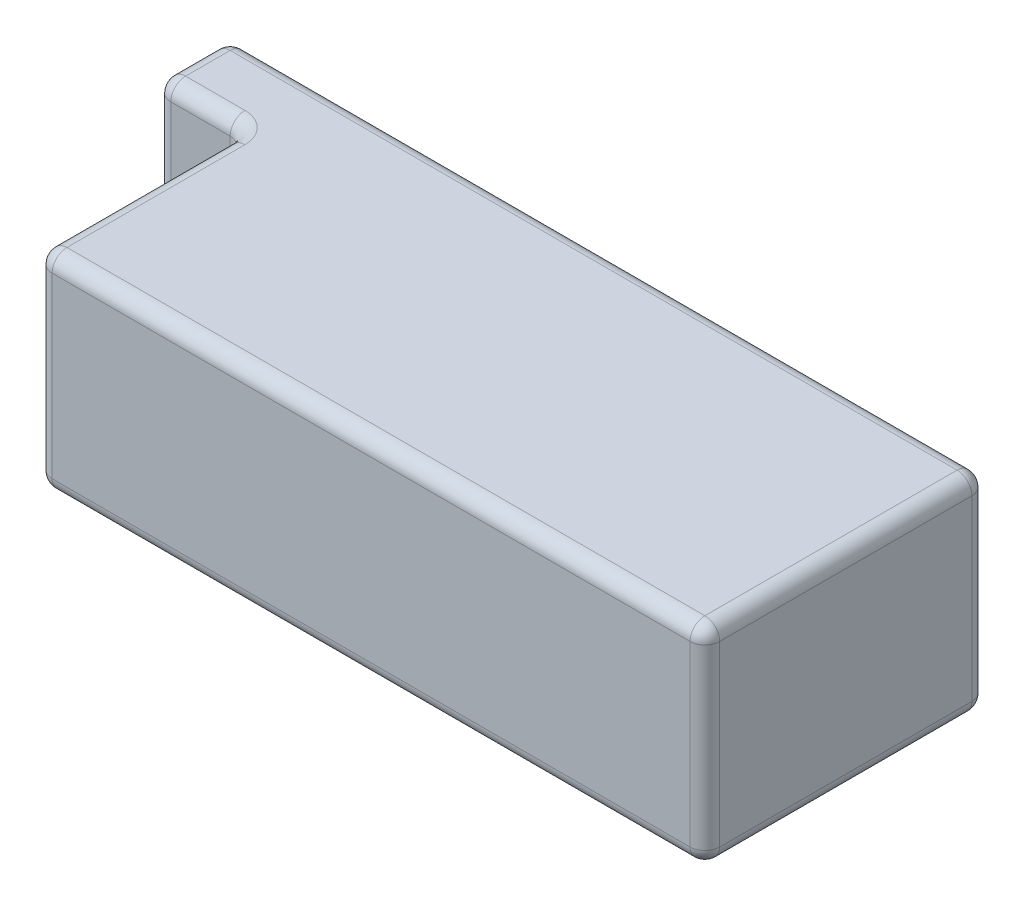
ISO-10303-21;
HEADER;
FILE_DESCRIPTION(('STEP AP214'),'2;1');
FILE_NAME('part.step','',(''),(''),'','','');
FILE_SCHEMA(('AUTOMOTIVE_DESIGN { 1 0 10303 214 1 1 1 1 }'));
ENDSEC;
DATA;
#1=APPLICATION_CONTEXT('core data for automotive mechanical design processes');
#2=APPLICATION_PROTOCOL_DEFINITION('international standard','automotive_design',2000,#1);
#3=PRODUCT_CONTEXT('',#1,'mechanical');
#4=PRODUCT('Part','Part','',(#3));
#5=PRODUCT_RELATED_PRODUCT_CATEGORY('part','',(#4));
#6=PRODUCT_DEFINITION_FORMATION('','',#4);
#7=PRODUCT_DEFINITION_CONTEXT('part definition',#1,'design');
#8=PRODUCT_DEFINITION('design','',#6,#7);
#9=PRODUCT_DEFINITION_SHAPE('','',#8);
#10=(LENGTH_UNIT() NAMED_UNIT(*) SI_UNIT(.MILLI.,.METRE.));
#11=(NAMED_UNIT(*) PLANE_ANGLE_UNIT() SI_UNIT($,.RADIAN.));
#12=(NAMED_UNIT(*) SI_UNIT($,.STERADIAN.) SOLID_ANGLE_UNIT());
#13=UNCERTAINTY_MEASURE_WITH_UNIT(LENGTH_MEASURE(1.E-05),#10,'distance_accuracy_value','');
#14=(GEOMETRIC_REPRESENTATION_CONTEXT(3) GLOBAL_UNCERTAINTY_ASSIGNED_CONTEXT((#13)) GLOBAL_UNIT_ASSIGNED_CONTEXT((#10,
#11,#12)) REPRESENTATION_CONTEXT('',''));
#15=CARTESIAN_POINT('',(0.,0.,0.));
#16=DIRECTION('',(0.,0.,1.));
#17=DIRECTION('',(1.,0.,0.));
#18=AXIS2_PLACEMENT_3D('',#15,#16,#17);
#19=CARTESIAN_POINT('',(22.5,14.,9.5));
#20=DIRECTION('',(-1.,0.,0.));
#21=DIRECTION('',(0.,0.,1.));
#22=AXIS2_PLACEMENT_3D('',#19,#20,#21);
#23=PLANE('',#22);
#24=DIRECTION('',(0.,-1.,0.));
#25=VECTOR('',#24,1.);
#26=CARTESIAN_POINT('',(22.5,14.,8.5));
#27=LINE('',#26,#25);
#28=CARTESIAN_POINT('',(22.5,13.,8.5));
#29=VERTEX_POINT('',#28);
#30=CARTESIAN_POINT('',(22.5,1.,8.5));
#31=VERTEX_POINT('',#30);
#32=EDGE_CURVE('E10',#29,#31,#27,.T.);
#33=ORIENTED_EDGE('',*,*,#32,.T.);
#34=DIRECTION('',(0.,0.,-1.));
#35=VECTOR('',#34,1.);
#36=CARTESIAN_POINT('',(22.5,1.,-9.5));
#37=LINE('',#36,#35);
#38=CARTESIAN_POINT('',(22.5,1.,-8.5));
#39=VERTEX_POINT('',#38);
#40=EDGE_CURVE('E146',#31,#39,#37,.T.);
#41=ORIENTED_EDGE('',*,*,#40,.T.);
#42=DIRECTION('',(0.,1.,0.));
#43=VECTOR('',#42,1.);
#44=CARTESIAN_POINT('',(22.5,14.,-8.5));
#45=LINE('',#44,#43);
#46=CARTESIAN_POINT('',(22.5,13.,-8.5));
#47=VERTEX_POINT('',#46);
#48=EDGE_CURVE('E169',#39,#47,#45,.T.);
#49=ORIENTED_EDGE('',*,*,#48,.T.);
#50=DIRECTION('',(0.,0.,1.));
#51=VECTOR('',#50,1.);
#52=CARTESIAN_POINT('',(22.5,13.,9.5));
#53=LINE('',#52,#51);
#54=EDGE_CURVE('E336',#47,#29,#53,.T.);
#55=ORIENTED_EDGE('',*,*,#54,.T.);
#56=EDGE_LOOP('',(#33,#41,#49,#55));
#57=FACE_BOUND('',#56,.T.);
#58=ADVANCED_FACE('F15',(#57),#23,.F.);
#59=CARTESIAN_POINT('',(-22.5,14.,-9.5));
#60=DIRECTION('',(0.,0.,1.));
#61=DIRECTION('',(1.,0.,0.));
#62=AXIS2_PLACEMENT_3D('',#59,#60,#61);
#63=PLANE('',#62);
#64=DIRECTION('',(0.,-1.,0.));
#65=VECTOR('',#64,1.);
#66=CARTESIAN_POINT('',(21.5,14.,-9.5));
#67=LINE('',#66,#65);
#68=CARTESIAN_POINT('',(21.5,13.,-9.5));
#69=VERTEX_POINT('',#68);
#70=CARTESIAN_POINT('',(21.5,1.,-9.5));
#71=VERTEX_POINT('',#70);
#72=EDGE_CURVE('E163',#69,#71,#67,.T.);
#73=ORIENTED_EDGE('',*,*,#72,.T.);
#74=DIRECTION('',(-1.,0.,0.));
#75=VECTOR('',#74,1.);
#76=CARTESIAN_POINT('',(-28.5,1.,-9.5));
#77=LINE('',#76,#75);
#78=CARTESIAN_POINT('',(-27.5,1.,-9.5));
#79=VERTEX_POINT('',#78);
#80=EDGE_CURVE('E314',#71,#79,#77,.T.);
#81=ORIENTED_EDGE('',*,*,#80,.T.);
#82=DIRECTION('',(0.,1.,0.));
#83=VECTOR('',#82,1.);
#84=CARTESIAN_POINT('',(-27.5,14.,-9.5));
#85=LINE('',#84,#83);
#86=CARTESIAN_POINT('',(-27.5,13.,-9.5));
#87=VERTEX_POINT('',#86);
#88=EDGE_CURVE('E200',#79,#87,#85,.T.);
#89=ORIENTED_EDGE('',*,*,#88,.T.);
#90=DIRECTION('',(1.,0.,0.));
#91=VECTOR('',#90,1.);
#92=CARTESIAN_POINT('',(-22.5,13.,-9.5));
#93=LINE('',#92,#91);
#94=EDGE_CURVE('E217',#87,#69,#93,.T.);
#95=ORIENTED_EDGE('',*,*,#94,.T.);
#96=EDGE_LOOP('',(#73,#81,#89,#95));
#97=FACE_BOUND('',#96,.T.);
#98=ADVANCED_FACE('F535',(#97),#63,.F.);
#99=CARTESIAN_POINT('',(-28.5,14.,-9.5));
#100=DIRECTION('',(1.,0.,0.));
#101=DIRECTION('',(0.,0.,-1.));
#102=AXIS2_PLACEMENT_3D('',#99,#100,#101);
#103=PLANE('',#102);
#104=DIRECTION('',(0.,-1.,0.));
#105=VECTOR('',#104,1.);
#106=CARTESIAN_POINT('',(-28.5,14.,-8.5));
#107=LINE('',#106,#105);
#108=CARTESIAN_POINT('',(-28.5,13.,-8.5));
#109=VERTEX_POINT('',#108);
#110=CARTESIAN_POINT('',(-28.5,1.,-8.5));
#111=VERTEX_POINT('',#110);
#112=EDGE_CURVE('E203',#109,#111,#107,.T.);
#113=ORIENTED_EDGE('',*,*,#112,.T.);
#114=DIRECTION('',(0.,0.,1.));
#115=VECTOR('',#114,1.);
#116=CARTESIAN_POINT('',(-28.5,1.,-4.5));
#117=LINE('',#116,#115);
#118=CARTESIAN_POINT('',(-28.5,1.,-5.5));
#119=VERTEX_POINT('',#118);
#120=EDGE_CURVE('E326',#111,#119,#117,.T.);
#121=ORIENTED_EDGE('',*,*,#120,.T.);
#122=DIRECTION('',(0.,1.,0.));
#123=VECTOR('',#122,1.);
#124=CARTESIAN_POINT('',(-28.5,14.,-5.5));
#125=LINE('',#124,#123);
#126=CARTESIAN_POINT('',(-28.5,13.,-5.5));
#127=VERTEX_POINT('',#126);
#128=EDGE_CURVE('E258',#119,#127,#125,.T.);
#129=ORIENTED_EDGE('',*,*,#128,.T.);
#130=DIRECTION('',(0.,0.,-1.));
#131=VECTOR('',#130,1.);
#132=CARTESIAN_POINT('',(-28.5,13.,-9.5));
#133=LINE('',#132,#131);
#134=EDGE_CURVE('E199',#127,#109,#133,.T.);
#135=ORIENTED_EDGE('',*,*,#134,.T.);
#136=EDGE_LOOP('',(#113,#121,#129,#135));
#137=FACE_BOUND('',#136,.T.);
#138=ADVANCED_FACE('F486',(#137),#103,.F.);
#139=CARTESIAN_POINT('',(-22.5,14.,-4.5));
#140=DIRECTION('',(0.,0.,-1.));
#141=DIRECTION('',(-1.,0.,0.));
#142=AXIS2_PLACEMENT_3D('',#139,#140,#141);
#143=PLANE('',#142);
#144=DIRECTION('',(0.,-1.,0.));
#145=VECTOR('',#144,1.);
#146=CARTESIAN_POINT('',(-27.5,14.,-4.5));
#147=LINE('',#146,#145);
#148=CARTESIAN_POINT('',(-27.5,13.,-4.5));
#149=VERTEX_POINT('',#148);
#150=CARTESIAN_POINT('',(-27.5,1.,-4.5));
#151=VERTEX_POINT('',#150);
#152=EDGE_CURVE('E249',#149,#151,#147,.T.);
#153=ORIENTED_EDGE('',*,*,#152,.T.);
#154=DIRECTION('',(1.,0.,0.));
#155=VECTOR('',#154,1.);
#156=CARTESIAN_POINT('',(-22.5,1.,-4.5));
#157=LINE('',#156,#155);
#158=CARTESIAN_POINT('',(-23.5,1.,-4.5));
#159=VERTEX_POINT('',#158);
#160=EDGE_CURVE('E325',#151,#159,#157,.T.);
#161=ORIENTED_EDGE('',*,*,#160,.T.);
#162=DIRECTION('',(0.,1.,0.));
#163=VECTOR('',#162,1.);
#164=CARTESIAN_POINT('',(-23.5,14.,-4.5));
#165=LINE('',#164,#163);
#166=CARTESIAN_POINT('',(-23.5,13.,-4.5));
#167=VERTEX_POINT('',#166);
#168=EDGE_CURVE('E284',#159,#167,#165,.T.);
#169=ORIENTED_EDGE('',*,*,#168,.T.);
#170=DIRECTION('',(-1.,0.,0.));
#171=VECTOR('',#170,1.);
#172=CARTESIAN_POINT('',(-22.5,13.,-4.5));
#173=LINE('',#172,#171);
#174=EDGE_CURVE('E185',#167,#149,#173,.T.);
#175=ORIENTED_EDGE('',*,*,#174,.T.);
#176=EDGE_LOOP('',(#153,#161,#169,#175));
#177=FACE_BOUND('',#176,.T.);
#178=ADVANCED_FACE('F438',(#177),#143,.F.);
#179=CARTESIAN_POINT('',(-22.5,14.,-4.5));
#180=DIRECTION('',(1.,0.,0.));
#181=DIRECTION('',(0.,1.,0.));
#182=AXIS2_PLACEMENT_3D('',#179,#180,#181);
#183=PLANE('',#182);
#184=DIRECTION('',(0.,-1.,0.));
#185=VECTOR('',#184,1.);
#186=CARTESIAN_POINT('',(-22.5,0.,-3.5));
#187=LINE('',#186,#185);
#188=CARTESIAN_POINT('',(-22.5,13.,-3.5));
#189=VERTEX_POINT('',#188);
#190=CARTESIAN_POINT('',(-22.5,1.,-3.5));
#191=VERTEX_POINT('',#190);
#192=EDGE_CURVE('E293',#189,#191,#187,.T.);
#193=ORIENTED_EDGE('',*,*,#192,.T.);
#194=DIRECTION('',(0.,0.,1.));
#195=VECTOR('',#194,1.);
#196=CARTESIAN_POINT('',(-22.5,1.,9.5));
#197=LINE('',#196,#195);
#198=CARTESIAN_POINT('',(-22.5,1.,8.5));
#199=VERTEX_POINT('',#198);
#200=EDGE_CURVE('E313',#191,#199,#197,.T.);
#201=ORIENTED_EDGE('',*,*,#200,.T.);
#202=DIRECTION('',(0.,1.,0.));
#203=VECTOR('',#202,1.);
#204=CARTESIAN_POINT('',(-22.5,14.,8.5));
#205=LINE('',#204,#203);
#206=CARTESIAN_POINT('',(-22.5,13.,8.5));
#207=VERTEX_POINT('',#206);
#208=EDGE_CURVE('E232',#199,#207,#205,.T.);
#209=ORIENTED_EDGE('',*,*,#208,.T.);
#210=DIRECTION('',(0.,0.,-1.));
#211=VECTOR('',#210,1.);
#212=CARTESIAN_POINT('',(-22.5,13.,-4.5));
#213=LINE('',#212,#211);
#214=EDGE_CURVE('E173',#207,#189,#213,.T.);
#215=ORIENTED_EDGE('',*,*,#214,.T.);
#216=EDGE_LOOP('',(#193,#201,#209,#215));
#217=FACE_BOUND('',#216,.T.);
#218=ADVANCED_FACE('F586',(#217),#183,.F.);
#219=CARTESIAN_POINT('',(-22.5,14.,9.5));
#220=DIRECTION('',(0.,0.,-1.));
#221=DIRECTION('',(0.,-1.,0.));
#222=AXIS2_PLACEMENT_3D('',#219,#220,#221);
#223=PLANE('',#222);
#224=DIRECTION('',(0.,-1.,0.));
#225=VECTOR('',#224,1.);
#226=CARTESIAN_POINT('',(-21.5,14.,9.5));
#227=LINE('',#226,#225);
#228=CARTESIAN_POINT('',(-21.5,13.,9.5));
#229=VERTEX_POINT('',#228);
#230=CARTESIAN_POINT('',(-21.5,1.,9.5));
#231=VERTEX_POINT('',#230);
#232=EDGE_CURVE('E135',#229,#231,#227,.T.);
#233=ORIENTED_EDGE('',*,*,#232,.T.);
#234=DIRECTION('',(1.,0.,0.));
#235=VECTOR('',#234,1.);
#236=CARTESIAN_POINT('',(22.5,1.,9.5));
#237=LINE('',#236,#235);
#238=CARTESIAN_POINT('',(21.5,1.,9.5));
#239=VERTEX_POINT('',#238);
#240=EDGE_CURVE('E136',#231,#239,#237,.T.);
#241=ORIENTED_EDGE('',*,*,#240,.T.);
#242=DIRECTION('',(0.,1.,0.));
#243=VECTOR('',#242,1.);
#244=CARTESIAN_POINT('',(21.5,14.,9.5));
#245=LINE('',#244,#243);
#246=CARTESIAN_POINT('',(21.5,13.,9.5));
#247=VERTEX_POINT('',#246);
#248=EDGE_CURVE('E26',#239,#247,#245,.T.);
#249=ORIENTED_EDGE('',*,*,#248,.T.);
#250=DIRECTION('',(-1.,0.,0.));
#251=VECTOR('',#250,1.);
#252=CARTESIAN_POINT('',(-22.5,13.,9.5));
#253=LINE('',#252,#251);
#254=EDGE_CURVE('E233',#247,#229,#253,.T.);
#255=ORIENTED_EDGE('',*,*,#254,.T.);
#256=EDGE_LOOP('',(#233,#241,#249,#255));
#257=FACE_BOUND('',#256,.T.);
#258=ADVANCED_FACE('F583',(#257),#223,.F.);
#259=CARTESIAN_POINT('',(22.5,14.,-9.5));
#260=DIRECTION('',(0.,-1.,0.));
#261=DIRECTION('',(0.,0.,-1.));
#262=AXIS2_PLACEMENT_3D('',#259,#260,#261);
#263=PLANE('',#262);
#264=CARTESIAN_POINT('',(-23.5,14.,-3.5));
#265=DIRECTION('',(0.,1.,0.));
#266=DIRECTION('',(0.,0.,-1.));
#267=AXIS2_PLACEMENT_3D('',#264,#265,#266);
#268=CIRCLE('',#267,2.);
#269=CARTESIAN_POINT('',(-21.5,14.,-3.5));
#270=VERTEX_POINT('',#269);
#271=CARTESIAN_POINT('',(-23.5,14.,-5.5));
#272=VERTEX_POINT('',#271);
#273=EDGE_CURVE('E304',#270,#272,#268,.T.);
#274=ORIENTED_EDGE('',*,*,#273,.F.);
#275=DIRECTION('',(0.,0.,1.));
#276=VECTOR('',#275,1.);
#277=CARTESIAN_POINT('',(-21.5,14.,-9.5));
#278=LINE('',#277,#276);
#279=CARTESIAN_POINT('',(-21.5,14.,8.5));
#280=VERTEX_POINT('',#279);
#281=EDGE_CURVE('E177',#270,#280,#278,.T.);
#282=ORIENTED_EDGE('',*,*,#281,.T.);
#283=DIRECTION('',(1.,0.,0.));
#284=VECTOR('',#283,1.);
#285=CARTESIAN_POINT('',(22.5,14.,8.5));
#286=LINE('',#285,#284);
#287=CARTESIAN_POINT('',(21.5,14.,8.5));
#288=VERTEX_POINT('',#287);
#289=EDGE_CURVE('E231',#280,#288,#286,.T.);
#290=ORIENTED_EDGE('',*,*,#289,.T.);
#291=DIRECTION('',(0.,0.,-1.));
#292=VECTOR('',#291,1.);
#293=CARTESIAN_POINT('',(21.5,14.,-9.5));
#294=LINE('',#293,#292);
#295=CARTESIAN_POINT('',(21.5,14.,-8.5));
#296=VERTEX_POINT('',#295);
#297=EDGE_CURVE('E337',#288,#296,#294,.T.);
#298=ORIENTED_EDGE('',*,*,#297,.T.);
#299=DIRECTION('',(-1.,0.,0.));
#300=VECTOR('',#299,1.);
#301=CARTESIAN_POINT('',(22.5,14.,-8.5));
#302=LINE('',#301,#300);
#303=CARTESIAN_POINT('',(-27.5,14.,-8.5));
#304=VERTEX_POINT('',#303);
#305=EDGE_CURVE('E226',#296,#304,#302,.T.);
#306=ORIENTED_EDGE('',*,*,#305,.T.);
#307=DIRECTION('',(0.,0.,1.));
#308=VECTOR('',#307,1.);
#309=CARTESIAN_POINT('',(-27.5,14.,-9.5));
#310=LINE('',#309,#308);
#311=CARTESIAN_POINT('',(-27.5,14.,-5.5));
#312=VERTEX_POINT('',#311);
#313=EDGE_CURVE('E206',#304,#312,#310,.T.);
#314=ORIENTED_EDGE('',*,*,#313,.T.);
#315=DIRECTION('',(1.,0.,0.));
#316=VECTOR('',#315,1.);
#317=CARTESIAN_POINT('',(22.5,14.,-5.5));
#318=LINE('',#317,#316);
#319=EDGE_CURVE('E189',#312,#272,#318,.T.);
#320=ORIENTED_EDGE('',*,*,#319,.T.);
#321=EDGE_LOOP('',(#274,#282,#290,#298,#306,#314,#320));
#322=FACE_BOUND('',#321,.T.);
#323=ADVANCED_FACE('F542',(#322),#263,.F.);
#324=CARTESIAN_POINT('',(22.5,0.,-9.5));
#325=DIRECTION('',(0.,-1.,0.));
#326=DIRECTION('',(0.,0.,-1.));
#327=AXIS2_PLACEMENT_3D('',#324,#325,#326);
#328=PLANE('',#327);
#329=DIRECTION('',(-1.,0.,0.));
#330=VECTOR('',#329,1.);
#331=CARTESIAN_POINT('',(-28.5,0.,-5.5));
#332=LINE('',#331,#330);
#333=CARTESIAN_POINT('',(-23.5,0.,-5.5));
#334=VERTEX_POINT('',#333);
#335=CARTESIAN_POINT('',(-27.5,0.,-5.5));
#336=VERTEX_POINT('',#335);
#337=EDGE_CURVE('E373',#334,#336,#332,.T.);
#338=ORIENTED_EDGE('',*,*,#337,.T.);
#339=DIRECTION('',(0.,0.,-1.));
#340=VECTOR('',#339,1.);
#341=CARTESIAN_POINT('',(-27.5,0.,-9.5));
#342=LINE('',#341,#340);
#343=CARTESIAN_POINT('',(-27.5,0.,-8.5));
#344=VERTEX_POINT('',#343);
#345=EDGE_CURVE('E342',#336,#344,#342,.T.);
#346=ORIENTED_EDGE('',*,*,#345,.T.);
#347=DIRECTION('',(1.,0.,0.));
#348=VECTOR('',#347,1.);
#349=CARTESIAN_POINT('',(22.5,0.,-8.5));
#350=LINE('',#349,#348);
#351=CARTESIAN_POINT('',(21.5,0.,-8.5));
#352=VERTEX_POINT('',#351);
#353=EDGE_CURVE('E153',#344,#352,#350,.T.);
#354=ORIENTED_EDGE('',*,*,#353,.T.);
#355=DIRECTION('',(0.,0.,1.));
#356=VECTOR('',#355,1.);
#357=CARTESIAN_POINT('',(21.5,0.,9.5));
#358=LINE('',#357,#356);
#359=CARTESIAN_POINT('',(21.5,0.,8.5));
#360=VERTEX_POINT('',#359);
#361=EDGE_CURVE('E149',#352,#360,#358,.T.);
#362=ORIENTED_EDGE('',*,*,#361,.T.);
#363=DIRECTION('',(-1.,0.,0.));
#364=VECTOR('',#363,1.);
#365=CARTESIAN_POINT('',(-22.5,0.,8.5));
#366=LINE('',#365,#364);
#367=CARTESIAN_POINT('',(-21.5,0.,8.5));
#368=VERTEX_POINT('',#367);
#369=EDGE_CURVE('E124',#360,#368,#366,.T.);
#370=ORIENTED_EDGE('',*,*,#369,.T.);
#371=DIRECTION('',(0.,0.,-1.));
#372=VECTOR('',#371,1.);
#373=CARTESIAN_POINT('',(-21.5,0.,-4.5));
#374=LINE('',#373,#372);
#375=CARTESIAN_POINT('',(-21.5,0.,-3.5));
#376=VERTEX_POINT('',#375);
#377=EDGE_CURVE('E377',#368,#376,#374,.T.);
#378=ORIENTED_EDGE('',*,*,#377,.T.);
#379=CARTESIAN_POINT('',(-23.5,0.,-3.5));
#380=DIRECTION('',(0.,-1.,0.));
#381=DIRECTION('',(0.,0.,-1.));
#382=AXIS2_PLACEMENT_3D('',#379,#380,#381);
#383=CIRCLE('',#382,2.);
#384=EDGE_CURVE('E330',#334,#376,#383,.T.);
#385=ORIENTED_EDGE('',*,*,#384,.F.);
#386=EDGE_LOOP('',(#338,#346,#354,#362,#370,#378,#385));
#387=FACE_BOUND('',#386,.T.);
#388=ADVANCED_FACE('F151',(#387),#328,.T.);
#389=CARTESIAN_POINT('',(21.5,14.,8.5));
#390=DIRECTION('',(0.,-1.,0.));
#391=DIRECTION('',(0.,0.,-1.));
#392=AXIS2_PLACEMENT_3D('',#389,#390,#391);
#393=CYLINDRICAL_SURFACE('',#392,1.);
#394=CARTESIAN_POINT('',(21.5,13.,8.5));
#395=DIRECTION('',(0.,1.,0.));
#396=DIRECTION('',(0.,0.,1.));
#397=AXIS2_PLACEMENT_3D('',#394,#395,#396);
#398=CIRCLE('',#397,1.);
#399=EDGE_CURVE('E241',#247,#29,#398,.T.);
#400=ORIENTED_EDGE('',*,*,#399,.F.);
#401=ORIENTED_EDGE('',*,*,#248,.F.);
#402=CARTESIAN_POINT('',(21.5,1.,8.5));
#403=DIRECTION('',(0.,-1.,0.));
#404=DIRECTION('',(0.,0.,-1.));
#405=AXIS2_PLACEMENT_3D('',#402,#403,#404);
#406=CIRCLE('',#405,1.);
#407=EDGE_CURVE('E143',#31,#239,#406,.T.);
#408=ORIENTED_EDGE('',*,*,#407,.F.);
#409=ORIENTED_EDGE('',*,*,#32,.F.);
#410=EDGE_LOOP('',(#400,#401,#408,#409));
#411=FACE_BOUND('',#410,.T.);
#412=ADVANCED_FACE('F603',(#411),#393,.T.);
#413=CARTESIAN_POINT('',(21.5,13.,8.5));
#414=DIRECTION('',(0.,1.,0.));
#415=DIRECTION('',(1.,0.,0.));
#416=AXIS2_PLACEMENT_3D('',#413,#414,#415);
#417=SPHERICAL_SURFACE('',#416,1.);
#418=CARTESIAN_POINT('',(21.5,13.,8.5));
#419=DIRECTION('',(-1.,0.,0.));
#420=DIRECTION('',(0.,0.,-1.));
#421=AXIS2_PLACEMENT_3D('',#418,#419,#420);
#422=CIRCLE('',#421,1.);
#423=EDGE_CURVE('E227',#247,#288,#422,.T.);
#424=ORIENTED_EDGE('',*,*,#423,.F.);
#425=ORIENTED_EDGE('',*,*,#399,.T.);
#426=CARTESIAN_POINT('',(21.5,13.,8.5));
#427=DIRECTION('',(0.,0.,-1.));
#428=DIRECTION('',(0.,-1.,0.));
#429=AXIS2_PLACEMENT_3D('',#426,#427,#428);
#430=CIRCLE('',#429,1.);
#431=EDGE_CURVE('E237',#288,#29,#430,.T.);
#432=ORIENTED_EDGE('',*,*,#431,.F.);
#433=EDGE_LOOP('',(#424,#425,#432));
#434=FACE_BOUND('',#433,.T.);
#435=ADVANCED_FACE('F606',(#434),#417,.T.);
#436=CARTESIAN_POINT('',(21.5,1.,8.5));
#437=DIRECTION('',(0.,1.,0.));
#438=DIRECTION('',(1.,0.,0.));
#439=AXIS2_PLACEMENT_3D('',#436,#437,#438);
#440=SPHERICAL_SURFACE('',#439,1.);
#441=CARTESIAN_POINT('',(21.5,1.,8.5));
#442=DIRECTION('',(0.,0.,-1.));
#443=DIRECTION('',(1.,0.,0.));
#444=AXIS2_PLACEMENT_3D('',#441,#442,#443);
#445=CIRCLE('',#444,1.);
#446=EDGE_CURVE('E142',#31,#360,#445,.T.);
#447=ORIENTED_EDGE('',*,*,#446,.F.);
#448=ORIENTED_EDGE('',*,*,#407,.T.);
#449=CARTESIAN_POINT('',(21.5,1.,8.5));
#450=DIRECTION('',(-1.,0.,0.));
#451=DIRECTION('',(0.,0.,-1.));
#452=AXIS2_PLACEMENT_3D('',#449,#450,#451);
#453=CIRCLE('',#452,1.);
#454=EDGE_CURVE('E128',#360,#239,#453,.T.);
#455=ORIENTED_EDGE('',*,*,#454,.F.);
#456=EDGE_LOOP('',(#447,#448,#455));
#457=FACE_BOUND('',#456,.T.);
#458=ADVANCED_FACE('F17',(#457),#440,.T.);
#459=CARTESIAN_POINT('',(21.5,13.,-9.5));
#460=DIRECTION('',(0.,0.,-1.));
#461=DIRECTION('',(-1.,0.,0.));
#462=AXIS2_PLACEMENT_3D('',#459,#460,#461);
#463=CYLINDRICAL_SURFACE('',#462,1.);
#464=ORIENTED_EDGE('',*,*,#431,.T.);
#465=ORIENTED_EDGE('',*,*,#54,.F.);
#466=CARTESIAN_POINT('',(21.5,13.,-8.5));
#467=DIRECTION('',(0.,0.,-1.));
#468=DIRECTION('',(-1.,0.,0.));
#469=AXIS2_PLACEMENT_3D('',#466,#467,#468);
#470=CIRCLE('',#469,1.);
#471=EDGE_CURVE('E179',#296,#47,#470,.T.);
#472=ORIENTED_EDGE('',*,*,#471,.F.);
#473=ORIENTED_EDGE('',*,*,#297,.F.);
#474=EDGE_LOOP('',(#464,#465,#472,#473));
#475=FACE_BOUND('',#474,.T.);
#476=ADVANCED_FACE('F546',(#475),#463,.T.);
#477=CARTESIAN_POINT('',(22.5,13.,8.5));
#478=DIRECTION('',(1.,0.,0.));
#479=DIRECTION('',(0.,0.,-1.));
#480=AXIS2_PLACEMENT_3D('',#477,#478,#479);
#481=CYLINDRICAL_SURFACE('',#480,1.);
#482=ORIENTED_EDGE('',*,*,#423,.T.);
#483=ORIENTED_EDGE('',*,*,#289,.F.);
#484=CARTESIAN_POINT('',(-21.5,13.,8.5));
#485=DIRECTION('',(-1.,0.,0.));
#486=DIRECTION('',(0.,0.,1.));
#487=AXIS2_PLACEMENT_3D('',#484,#485,#486);
#488=CIRCLE('',#487,1.);
#489=EDGE_CURVE('E184',#229,#280,#488,.T.);
#490=ORIENTED_EDGE('',*,*,#489,.F.);
#491=ORIENTED_EDGE('',*,*,#254,.F.);
#492=EDGE_LOOP('',(#482,#483,#490,#491));
#493=FACE_BOUND('',#492,.T.);
#494=ADVANCED_FACE('F780',(#493),#481,.T.);
#495=CARTESIAN_POINT('',(-21.5,14.,8.5));
#496=DIRECTION('',(0.,-1.,0.));
#497=DIRECTION('',(0.,0.,-1.));
#498=AXIS2_PLACEMENT_3D('',#495,#496,#497);
#499=CYLINDRICAL_SURFACE('',#498,1.);
#500=CARTESIAN_POINT('',(-21.5,1.,8.5));
#501=DIRECTION('',(0.,-1.,0.));
#502=DIRECTION('',(0.,0.,-1.));
#503=AXIS2_PLACEMENT_3D('',#500,#501,#502);
#504=CIRCLE('',#503,1.);
#505=EDGE_CURVE('E246',#231,#199,#504,.T.);
#506=ORIENTED_EDGE('',*,*,#505,.F.);
#507=ORIENTED_EDGE('',*,*,#232,.F.);
#508=CARTESIAN_POINT('',(-21.5,13.,8.5));
#509=DIRECTION('',(0.,1.,0.));
#510=DIRECTION('',(0.,0.,1.));
#511=AXIS2_PLACEMENT_3D('',#508,#509,#510);
#512=CIRCLE('',#511,1.);
#513=EDGE_CURVE('E242',#207,#229,#512,.T.);
#514=ORIENTED_EDGE('',*,*,#513,.F.);
#515=ORIENTED_EDGE('',*,*,#208,.F.);
#516=EDGE_LOOP('',(#506,#507,#514,#515));
#517=FACE_BOUND('',#516,.T.);
#518=ADVANCED_FACE('F612',(#517),#499,.T.);
#519=CARTESIAN_POINT('',(-22.5,1.,8.5));
#520=DIRECTION('',(-1.,0.,0.));
#521=DIRECTION('',(0.,0.,1.));
#522=AXIS2_PLACEMENT_3D('',#519,#520,#521);
#523=CYLINDRICAL_SURFACE('',#522,1.);
#524=ORIENTED_EDGE('',*,*,#454,.T.);
#525=ORIENTED_EDGE('',*,*,#240,.F.);
#526=CARTESIAN_POINT('',(-21.5,1.,8.5));
#527=DIRECTION('',(-1.,0.,0.));
#528=DIRECTION('',(0.,0.,1.));
#529=AXIS2_PLACEMENT_3D('',#526,#527,#528);
#530=CIRCLE('',#529,1.);
#531=EDGE_CURVE('E130',#368,#231,#530,.T.);
#532=ORIENTED_EDGE('',*,*,#531,.F.);
#533=ORIENTED_EDGE('',*,*,#369,.F.);
#534=EDGE_LOOP('',(#524,#525,#532,#533));
#535=FACE_BOUND('',#534,.T.);
#536=ADVANCED_FACE('F126',(#535),#523,.T.);
#537=CARTESIAN_POINT('',(21.5,1.,9.5));
#538=DIRECTION('',(0.,0.,1.));
#539=DIRECTION('',(1.,0.,0.));
#540=AXIS2_PLACEMENT_3D('',#537,#538,#539);
#541=CYLINDRICAL_SURFACE('',#540,1.);
#542=ORIENTED_EDGE('',*,*,#446,.T.);
#543=ORIENTED_EDGE('',*,*,#361,.F.);
#544=CARTESIAN_POINT('',(21.5,1.,-8.5));
#545=DIRECTION('',(0.,0.,-1.));
#546=DIRECTION('',(-1.,0.,0.));
#547=AXIS2_PLACEMENT_3D('',#544,#545,#546);
#548=CIRCLE('',#547,1.);
#549=EDGE_CURVE('E381',#39,#352,#548,.T.);
#550=ORIENTED_EDGE('',*,*,#549,.F.);
#551=ORIENTED_EDGE('',*,*,#40,.F.);
#552=EDGE_LOOP('',(#542,#543,#550,#551));
#553=FACE_BOUND('',#552,.T.);
#554=ADVANCED_FACE('F161',(#553),#541,.T.);
#555=CARTESIAN_POINT('',(21.5,14.,-8.5));
#556=DIRECTION('',(0.,-1.,0.));
#557=DIRECTION('',(0.,0.,-1.));
#558=AXIS2_PLACEMENT_3D('',#555,#556,#557);
#559=CYLINDRICAL_SURFACE('',#558,1.);
#560=CARTESIAN_POINT('',(21.5,13.,-8.5));
#561=DIRECTION('',(0.,1.,0.));
#562=DIRECTION('',(0.,0.,1.));
#563=AXIS2_PLACEMENT_3D('',#560,#561,#562);
#564=CIRCLE('',#563,1.);
#565=EDGE_CURVE('E183',#47,#69,#564,.T.);
#566=ORIENTED_EDGE('',*,*,#565,.F.);
#567=ORIENTED_EDGE('',*,*,#48,.F.);
#568=CARTESIAN_POINT('',(21.5,1.,-8.5));
#569=DIRECTION('',(0.,-1.,0.));
#570=DIRECTION('',(0.,0.,-1.));
#571=AXIS2_PLACEMENT_3D('',#568,#569,#570);
#572=CIRCLE('',#571,1.);
#573=EDGE_CURVE('E390',#71,#39,#572,.T.);
#574=ORIENTED_EDGE('',*,*,#573,.F.);
#575=ORIENTED_EDGE('',*,*,#72,.F.);
#576=EDGE_LOOP('',(#566,#567,#574,#575));
#577=FACE_BOUND('',#576,.T.);
#578=ADVANCED_FACE('F526',(#577),#559,.T.);
#579=CARTESIAN_POINT('',(21.5,13.,-8.5));
#580=DIRECTION('',(0.,1.,0.));
#581=DIRECTION('',(1.,0.,0.));
#582=AXIS2_PLACEMENT_3D('',#579,#580,#581);
#583=SPHERICAL_SURFACE('',#582,1.);
#584=ORIENTED_EDGE('',*,*,#471,.T.);
#585=ORIENTED_EDGE('',*,*,#565,.T.);
#586=CARTESIAN_POINT('',(21.5,13.,-8.5));
#587=DIRECTION('',(-1.,0.,0.));
#588=DIRECTION('',(0.,0.,-1.));
#589=AXIS2_PLACEMENT_3D('',#586,#587,#588);
#590=CIRCLE('',#589,1.);
#591=EDGE_CURVE('E176',#296,#69,#590,.T.);
#592=ORIENTED_EDGE('',*,*,#591,.F.);
#593=EDGE_LOOP('',(#584,#585,#592));
#594=FACE_BOUND('',#593,.T.);
#595=ADVANCED_FACE('F532',(#594),#583,.T.);
#596=CARTESIAN_POINT('',(-21.5,13.,8.5));
#597=DIRECTION('',(0.,1.,0.));
#598=DIRECTION('',(1.,0.,0.));
#599=AXIS2_PLACEMENT_3D('',#596,#597,#598);
#600=SPHERICAL_SURFACE('',#599,1.);
#601=ORIENTED_EDGE('',*,*,#513,.T.);
#602=ORIENTED_EDGE('',*,*,#489,.T.);
#603=CARTESIAN_POINT('',(-21.5,13.,8.5));
#604=DIRECTION('',(0.,0.,-1.));
#605=DIRECTION('',(1.,0.,0.));
#606=AXIS2_PLACEMENT_3D('',#603,#604,#605);
#607=CIRCLE('',#606,1.);
#608=EDGE_CURVE('E276',#207,#280,#607,.T.);
#609=ORIENTED_EDGE('',*,*,#608,.F.);
#610=EDGE_LOOP('',(#601,#602,#609));
#611=FACE_BOUND('',#610,.T.);
#612=ADVANCED_FACE('F597',(#611),#600,.T.);
#613=CARTESIAN_POINT('',(-21.5,1.,8.5));
#614=DIRECTION('',(0.,1.,0.));
#615=DIRECTION('',(1.,0.,0.));
#616=AXIS2_PLACEMENT_3D('',#613,#614,#615);
#617=SPHERICAL_SURFACE('',#616,1.);
#618=ORIENTED_EDGE('',*,*,#531,.T.);
#619=ORIENTED_EDGE('',*,*,#505,.T.);
#620=CARTESIAN_POINT('',(-21.5,1.,8.5));
#621=DIRECTION('',(0.,0.,-1.));
#622=DIRECTION('',(1.,0.,0.));
#623=AXIS2_PLACEMENT_3D('',#620,#621,#622);
#624=CIRCLE('',#623,1.);
#625=EDGE_CURVE('E309',#368,#199,#624,.T.);
#626=ORIENTED_EDGE('',*,*,#625,.F.);
#627=EDGE_LOOP('',(#618,#619,#626));
#628=FACE_BOUND('',#627,.T.);
#629=ADVANCED_FACE('F594',(#628),#617,.T.);
#630=CARTESIAN_POINT('',(21.5,1.,-8.5));
#631=DIRECTION('',(0.,1.,0.));
#632=DIRECTION('',(1.,0.,0.));
#633=AXIS2_PLACEMENT_3D('',#630,#631,#632);
#634=SPHERICAL_SURFACE('',#633,1.);
#635=ORIENTED_EDGE('',*,*,#573,.T.);
#636=ORIENTED_EDGE('',*,*,#549,.T.);
#637=CARTESIAN_POINT('',(21.5,1.,-8.5));
#638=DIRECTION('',(-1.,0.,0.));
#639=DIRECTION('',(0.,0.,-1.));
#640=AXIS2_PLACEMENT_3D('',#637,#638,#639);
#641=CIRCLE('',#640,1.);
#642=EDGE_CURVE('E266',#71,#352,#641,.T.);
#643=ORIENTED_EDGE('',*,*,#642,.F.);
#644=EDGE_LOOP('',(#635,#636,#643));
#645=FACE_BOUND('',#644,.T.);
#646=ADVANCED_FACE('F548',(#645),#634,.T.);
#647=CARTESIAN_POINT('',(22.5,13.,-8.5));
#648=DIRECTION('',(-1.,0.,0.));
#649=DIRECTION('',(0.,0.,1.));
#650=AXIS2_PLACEMENT_3D('',#647,#648,#649);
#651=CYLINDRICAL_SURFACE('',#650,1.);
#652=ORIENTED_EDGE('',*,*,#591,.T.);
#653=ORIENTED_EDGE('',*,*,#94,.F.);
#654=CARTESIAN_POINT('',(-27.5,13.,-8.5));
#655=DIRECTION('',(-1.,0.,0.));
#656=DIRECTION('',(0.,0.,1.));
#657=AXIS2_PLACEMENT_3D('',#654,#655,#656);
#658=CIRCLE('',#657,1.);
#659=EDGE_CURVE('E344',#304,#87,#658,.T.);
#660=ORIENTED_EDGE('',*,*,#659,.F.);
#661=ORIENTED_EDGE('',*,*,#305,.F.);
#662=EDGE_LOOP('',(#652,#653,#660,#661));
#663=FACE_BOUND('',#662,.T.);
#664=ADVANCED_FACE('F541',(#663),#651,.T.);
#665=CARTESIAN_POINT('',(-21.5,13.,-9.5));
#666=DIRECTION('',(0.,0.,1.));
#667=DIRECTION('',(1.,0.,0.));
#668=AXIS2_PLACEMENT_3D('',#665,#666,#667);
#669=CYLINDRICAL_SURFACE('',#668,1.);
#670=ORIENTED_EDGE('',*,*,#608,.T.);
#671=ORIENTED_EDGE('',*,*,#281,.F.);
#672=CARTESIAN_POINT('',(-21.5,13.,-3.5));
#673=DIRECTION('',(0.,0.,-1.));
#674=DIRECTION('',(-1.,0.,0.));
#675=AXIS2_PLACEMENT_3D('',#672,#673,#674);
#676=CIRCLE('',#675,1.);
#677=EDGE_CURVE('E19',#189,#270,#676,.T.);
#678=ORIENTED_EDGE('',*,*,#677,.F.);
#679=ORIENTED_EDGE('',*,*,#214,.F.);
#680=EDGE_LOOP('',(#670,#671,#678,#679));
#681=FACE_BOUND('',#680,.T.);
#682=ADVANCED_FACE('F862',(#681),#669,.T.);
#683=CARTESIAN_POINT('',(-23.5,14.,-3.5));
#684=DIRECTION('',(0.,1.,0.));
#685=DIRECTION('',(0.,0.,1.));
#686=AXIS2_PLACEMENT_3D('',#683,#684,#685);
#687=CYLINDRICAL_SURFACE('',#686,1.);
#688=CARTESIAN_POINT('',(-23.5,1.,-3.5));
#689=DIRECTION('',(0.,1.,0.));
#690=DIRECTION('',(0.,0.,-1.));
#691=AXIS2_PLACEMENT_3D('',#688,#689,#690);
#692=CIRCLE('',#691,1.);
#693=EDGE_CURVE('E302',#191,#159,#692,.T.);
#694=ORIENTED_EDGE('',*,*,#693,.F.);
#695=ORIENTED_EDGE('',*,*,#192,.F.);
#696=CARTESIAN_POINT('',(-23.5,13.,-3.5));
#697=DIRECTION('',(0.,-1.,0.));
#698=DIRECTION('',(0.,0.,-1.));
#699=AXIS2_PLACEMENT_3D('',#696,#697,#698);
#700=CIRCLE('',#699,1.);
#701=EDGE_CURVE('E308',#167,#189,#700,.T.);
#702=ORIENTED_EDGE('',*,*,#701,.F.);
#703=ORIENTED_EDGE('',*,*,#168,.F.);
#704=EDGE_LOOP('',(#694,#695,#702,#703));
#705=FACE_BOUND('',#704,.T.);
#706=ADVANCED_FACE('F430',(#705),#687,.F.);
#707=CARTESIAN_POINT('',(-21.5,1.,-4.5));
#708=DIRECTION('',(0.,0.,-1.));
#709=DIRECTION('',(-1.,0.,0.));
#710=AXIS2_PLACEMENT_3D('',#707,#708,#709);
#711=CYLINDRICAL_SURFACE('',#710,1.);
#712=ORIENTED_EDGE('',*,*,#625,.T.);
#713=ORIENTED_EDGE('',*,*,#200,.F.);
#714=CARTESIAN_POINT('',(-21.5,1.,-3.5));
#715=DIRECTION('',(0.,0.,-1.));
#716=DIRECTION('',(-1.,0.,0.));
#717=AXIS2_PLACEMENT_3D('',#714,#715,#716);
#718=CIRCLE('',#717,1.);
#719=EDGE_CURVE('E298',#376,#191,#718,.T.);
#720=ORIENTED_EDGE('',*,*,#719,.F.);
#721=ORIENTED_EDGE('',*,*,#377,.F.);
#722=EDGE_LOOP('',(#712,#713,#720,#721));
#723=FACE_BOUND('',#722,.T.);
#724=ADVANCED_FACE('F423',(#723),#711,.T.);
#725=CARTESIAN_POINT('',(-22.5,1.,-8.5));
#726=DIRECTION('',(1.,0.,0.));
#727=DIRECTION('',(0.,0.,-1.));
#728=AXIS2_PLACEMENT_3D('',#725,#726,#727);
#729=CYLINDRICAL_SURFACE('',#728,1.);
#730=ORIENTED_EDGE('',*,*,#642,.T.);
#731=ORIENTED_EDGE('',*,*,#353,.F.);
#732=CARTESIAN_POINT('',(-27.5,1.,-8.5));
#733=DIRECTION('',(-1.,0.,0.));
#734=DIRECTION('',(0.,0.,1.));
#735=AXIS2_PLACEMENT_3D('',#732,#733,#734);
#736=CIRCLE('',#735,1.);
#737=EDGE_CURVE('E303',#79,#344,#736,.T.);
#738=ORIENTED_EDGE('',*,*,#737,.F.);
#739=ORIENTED_EDGE('',*,*,#80,.F.);
#740=EDGE_LOOP('',(#730,#731,#738,#739));
#741=FACE_BOUND('',#740,.T.);
#742=ADVANCED_FACE('F550',(#741),#729,.T.);
#743=CARTESIAN_POINT('',(-27.5,14.,-8.5));
#744=DIRECTION('',(0.,-1.,0.));
#745=DIRECTION('',(0.,0.,-1.));
#746=AXIS2_PLACEMENT_3D('',#743,#744,#745);
#747=CYLINDRICAL_SURFACE('',#746,1.);
#748=CARTESIAN_POINT('',(-27.5,13.,-8.5));
#749=DIRECTION('',(0.,1.,0.));
#750=DIRECTION('',(0.,0.,1.));
#751=AXIS2_PLACEMENT_3D('',#748,#749,#750);
#752=CIRCLE('',#751,1.);
#753=EDGE_CURVE('E204',#87,#109,#752,.T.);
#754=ORIENTED_EDGE('',*,*,#753,.F.);
#755=ORIENTED_EDGE('',*,*,#88,.F.);
#756=CARTESIAN_POINT('',(-27.5,1.,-8.5));
#757=DIRECTION('',(0.,-1.,0.));
#758=DIRECTION('',(0.,0.,-1.));
#759=AXIS2_PLACEMENT_3D('',#756,#757,#758);
#760=CIRCLE('',#759,1.);
#761=EDGE_CURVE('E209',#111,#79,#760,.T.);
#762=ORIENTED_EDGE('',*,*,#761,.F.);
#763=ORIENTED_EDGE('',*,*,#112,.F.);
#764=EDGE_LOOP('',(#754,#755,#762,#763));
#765=FACE_BOUND('',#764,.T.);
#766=ADVANCED_FACE('F553',(#765),#747,.T.);
#767=CARTESIAN_POINT('',(-27.5,13.,-8.5));
#768=DIRECTION('',(0.,1.,0.));
#769=DIRECTION('',(1.,0.,0.));
#770=AXIS2_PLACEMENT_3D('',#767,#768,#769);
#771=SPHERICAL_SURFACE('',#770,1.);
#772=ORIENTED_EDGE('',*,*,#659,.T.);
#773=ORIENTED_EDGE('',*,*,#753,.T.);
#774=CARTESIAN_POINT('',(-27.5,13.,-8.5));
#775=DIRECTION('',(0.,0.,1.));
#776=DIRECTION('',(-1.,0.,0.));
#777=AXIS2_PLACEMENT_3D('',#774,#775,#776);
#778=CIRCLE('',#777,1.);
#779=EDGE_CURVE('E188',#304,#109,#778,.T.);
#780=ORIENTED_EDGE('',*,*,#779,.F.);
#781=EDGE_LOOP('',(#772,#773,#780));
#782=FACE_BOUND('',#781,.T.);
#783=ADVANCED_FACE('F558',(#782),#771,.T.);
#784=CARTESIAN_POINT('',(-23.5,13.,-3.5));
#785=DIRECTION('',(0.,-1.,0.));
#786=DIRECTION('',(0.,0.,-1.));
#787=AXIS2_PLACEMENT_3D('',#784,#785,#786);
#788=TOROIDAL_SURFACE('',#787,2.,1.);
#789=ORIENTED_EDGE('',*,*,#677,.T.);
#790=ORIENTED_EDGE('',*,*,#273,.T.);
#791=CARTESIAN_POINT('',(-23.5,13.,-5.5));
#792=DIRECTION('',(-1.,0.,0.));
#793=DIRECTION('',(0.,0.,-1.));
#794=AXIS2_PLACEMENT_3D('',#791,#792,#793);
#795=CIRCLE('',#794,1.);
#796=EDGE_CURVE('E271',#167,#272,#795,.T.);
#797=ORIENTED_EDGE('',*,*,#796,.F.);
#798=ORIENTED_EDGE('',*,*,#701,.T.);
#799=EDGE_LOOP('',(#789,#790,#797,#798));
#800=FACE_BOUND('',#799,.T.);
#801=ADVANCED_FACE('F634',(#800),#788,.T.);
#802=CARTESIAN_POINT('',(-23.5,1.,-3.5));
#803=DIRECTION('',(0.,-1.,0.));
#804=DIRECTION('',(0.,0.,-1.));
#805=AXIS2_PLACEMENT_3D('',#802,#803,#804);
#806=TOROIDAL_SURFACE('',#805,2.,1.);
#807=ORIENTED_EDGE('',*,*,#719,.T.);
#808=ORIENTED_EDGE('',*,*,#693,.T.);
#809=CARTESIAN_POINT('',(-23.5,1.,-5.5));
#810=DIRECTION('',(-1.,0.,0.));
#811=DIRECTION('',(0.,0.,-1.));
#812=AXIS2_PLACEMENT_3D('',#809,#810,#811);
#813=CIRCLE('',#812,1.);
#814=EDGE_CURVE('E321',#334,#159,#813,.T.);
#815=ORIENTED_EDGE('',*,*,#814,.F.);
#816=ORIENTED_EDGE('',*,*,#384,.T.);
#817=EDGE_LOOP('',(#807,#808,#815,#816));
#818=FACE_BOUND('',#817,.T.);
#819=ADVANCED_FACE('F422',(#818),#806,.T.);
#820=CARTESIAN_POINT('',(-27.5,1.,-8.5));
#821=DIRECTION('',(0.,1.,0.));
#822=DIRECTION('',(1.,0.,0.));
#823=AXIS2_PLACEMENT_3D('',#820,#821,#822);
#824=SPHERICAL_SURFACE('',#823,1.);
#825=ORIENTED_EDGE('',*,*,#761,.T.);
#826=ORIENTED_EDGE('',*,*,#737,.T.);
#827=CARTESIAN_POINT('',(-27.5,1.,-8.5));
#828=DIRECTION('',(0.,0.,1.));
#829=DIRECTION('',(-1.,0.,0.));
#830=AXIS2_PLACEMENT_3D('',#827,#828,#829);
#831=CIRCLE('',#830,1.);
#832=EDGE_CURVE('E213',#111,#344,#831,.T.);
#833=ORIENTED_EDGE('',*,*,#832,.F.);
#834=EDGE_LOOP('',(#825,#826,#833));
#835=FACE_BOUND('',#834,.T.);
#836=ADVANCED_FACE('F562',(#835),#824,.T.);
#837=CARTESIAN_POINT('',(-27.5,13.,-9.5));
#838=DIRECTION('',(0.,0.,1.));
#839=DIRECTION('',(1.,0.,0.));
#840=AXIS2_PLACEMENT_3D('',#837,#838,#839);
#841=CYLINDRICAL_SURFACE('',#840,1.);
#842=ORIENTED_EDGE('',*,*,#779,.T.);
#843=ORIENTED_EDGE('',*,*,#134,.F.);
#844=CARTESIAN_POINT('',(-27.5,13.,-5.5));
#845=DIRECTION('',(0.,0.,1.));
#846=DIRECTION('',(1.,0.,0.));
#847=AXIS2_PLACEMENT_3D('',#844,#845,#846);
#848=CIRCLE('',#847,1.);
#849=EDGE_CURVE('E194',#312,#127,#848,.T.);
#850=ORIENTED_EDGE('',*,*,#849,.F.);
#851=ORIENTED_EDGE('',*,*,#313,.F.);
#852=EDGE_LOOP('',(#842,#843,#850,#851));
#853=FACE_BOUND('',#852,.T.);
#854=ADVANCED_FACE('F559',(#853),#841,.T.);
#855=CARTESIAN_POINT('',(22.5,13.,-5.5));
#856=DIRECTION('',(1.,0.,0.));
#857=DIRECTION('',(0.,0.,-1.));
#858=AXIS2_PLACEMENT_3D('',#855,#856,#857);
#859=CYLINDRICAL_SURFACE('',#858,1.);
#860=ORIENTED_EDGE('',*,*,#796,.T.);
#861=ORIENTED_EDGE('',*,*,#319,.F.);
#862=CARTESIAN_POINT('',(-27.5,13.,-5.5));
#863=DIRECTION('',(-1.,0.,0.));
#864=DIRECTION('',(0.,-1.,0.));
#865=AXIS2_PLACEMENT_3D('',#862,#863,#864);
#866=CIRCLE('',#865,1.);
#867=EDGE_CURVE('E190',#149,#312,#866,.T.);
#868=ORIENTED_EDGE('',*,*,#867,.F.);
#869=ORIENTED_EDGE('',*,*,#174,.F.);
#870=EDGE_LOOP('',(#860,#861,#868,#869));
#871=FACE_BOUND('',#870,.T.);
#872=ADVANCED_FACE('F561',(#871),#859,.T.);
#873=CARTESIAN_POINT('',(-22.5,1.,-5.5));
#874=DIRECTION('',(-1.,0.,0.));
#875=DIRECTION('',(0.,0.,1.));
#876=AXIS2_PLACEMENT_3D('',#873,#874,#875);
#877=CYLINDRICAL_SURFACE('',#876,1.);
#878=ORIENTED_EDGE('',*,*,#814,.T.);
#879=ORIENTED_EDGE('',*,*,#160,.F.);
#880=CARTESIAN_POINT('',(-27.5,1.,-5.5));
#881=DIRECTION('',(-1.,0.,0.));
#882=DIRECTION('',(0.,0.,1.));
#883=AXIS2_PLACEMENT_3D('',#880,#881,#882);
#884=CIRCLE('',#883,1.);
#885=EDGE_CURVE('E195',#336,#151,#884,.T.);
#886=ORIENTED_EDGE('',*,*,#885,.F.);
#887=ORIENTED_EDGE('',*,*,#337,.F.);
#888=EDGE_LOOP('',(#878,#879,#886,#887));
#889=FACE_BOUND('',#888,.T.);
#890=ADVANCED_FACE('F444',(#889),#877,.T.);
#891=CARTESIAN_POINT('',(-27.5,1.,-9.5));
#892=DIRECTION('',(0.,0.,-1.));
#893=DIRECTION('',(-1.,0.,0.));
#894=AXIS2_PLACEMENT_3D('',#891,#892,#893);
#895=CYLINDRICAL_SURFACE('',#894,1.);
#896=ORIENTED_EDGE('',*,*,#832,.T.);
#897=ORIENTED_EDGE('',*,*,#345,.F.);
#898=CARTESIAN_POINT('',(-27.5,1.,-5.5));
#899=DIRECTION('',(0.,0.,1.));
#900=DIRECTION('',(1.,0.,0.));
#901=AXIS2_PLACEMENT_3D('',#898,#899,#900);
#902=CIRCLE('',#901,1.);
#903=EDGE_CURVE('E253',#119,#336,#902,.T.);
#904=ORIENTED_EDGE('',*,*,#903,.F.);
#905=ORIENTED_EDGE('',*,*,#120,.F.);
#906=EDGE_LOOP('',(#896,#897,#904,#905));
#907=FACE_BOUND('',#906,.T.);
#908=ADVANCED_FACE('F495',(#907),#895,.T.);
#909=CARTESIAN_POINT('',(-27.5,13.,-5.5));
#910=DIRECTION('',(0.,1.,0.));
#911=DIRECTION('',(1.,0.,0.));
#912=AXIS2_PLACEMENT_3D('',#909,#910,#911);
#913=SPHERICAL_SURFACE('',#912,1.);
#914=ORIENTED_EDGE('',*,*,#867,.T.);
#915=ORIENTED_EDGE('',*,*,#849,.T.);
#916=CARTESIAN_POINT('',(-27.5,13.,-5.5));
#917=DIRECTION('',(0.,-1.,0.));
#918=DIRECTION('',(0.,0.,1.));
#919=AXIS2_PLACEMENT_3D('',#916,#917,#918);
#920=CIRCLE('',#919,1.);
#921=EDGE_CURVE('E262',#149,#127,#920,.T.);
#922=ORIENTED_EDGE('',*,*,#921,.F.);
#923=EDGE_LOOP('',(#914,#915,#922));
#924=FACE_BOUND('',#923,.T.);
#925=ADVANCED_FACE('F480',(#924),#913,.T.);
#926=CARTESIAN_POINT('',(-27.5,1.,-5.5));
#927=DIRECTION('',(0.,1.,0.));
#928=DIRECTION('',(1.,0.,0.));
#929=AXIS2_PLACEMENT_3D('',#926,#927,#928);
#930=SPHERICAL_SURFACE('',#929,1.);
#931=ORIENTED_EDGE('',*,*,#903,.T.);
#932=ORIENTED_EDGE('',*,*,#885,.T.);
#933=CARTESIAN_POINT('',(-27.5,1.,-5.5));
#934=DIRECTION('',(0.,1.,0.));
#935=DIRECTION('',(0.,0.,-1.));
#936=AXIS2_PLACEMENT_3D('',#933,#934,#935);
#937=CIRCLE('',#936,1.);
#938=EDGE_CURVE('E254',#119,#151,#937,.T.);
#939=ORIENTED_EDGE('',*,*,#938,.F.);
#940=EDGE_LOOP('',(#931,#932,#939));
#941=FACE_BOUND('',#940,.T.);
#942=ADVANCED_FACE('F497',(#941),#930,.T.);
#943=CARTESIAN_POINT('',(-27.5,14.,-5.5));
#944=DIRECTION('',(0.,-1.,0.));
#945=DIRECTION('',(0.,0.,-1.));
#946=AXIS2_PLACEMENT_3D('',#943,#944,#945);
#947=CYLINDRICAL_SURFACE('',#946,1.);
#948=ORIENTED_EDGE('',*,*,#921,.T.);
#949=ORIENTED_EDGE('',*,*,#128,.F.);
#950=ORIENTED_EDGE('',*,*,#938,.T.);
#951=ORIENTED_EDGE('',*,*,#152,.F.);
#952=EDGE_LOOP('',(#948,#949,#950,#951));
#953=FACE_BOUND('',#952,.T.);
#954=ADVANCED_FACE('F474',(#953),#947,.T.);
#955=CLOSED_SHELL('',(#58,#98,#138,#178,#218,#258,#323,#388,#412,#435,#458,#476,#494,#518,#536,
#554,#578,#595,#612,#629,#646,#664,#682,#706,#724,#742,#766,#783,#801,#819,#836,#854,#872,#890,
#908,#925,#942,#954));
#956=MANIFOLD_SOLID_BREP('B1',#955);
#957=ADVANCED_BREP_SHAPE_REPRESENTATION('',(#18,#956),#14);
#958=SHAPE_DEFINITION_REPRESENTATION(#9,#957);
ENDSEC;
END-ISO-10303-21;
